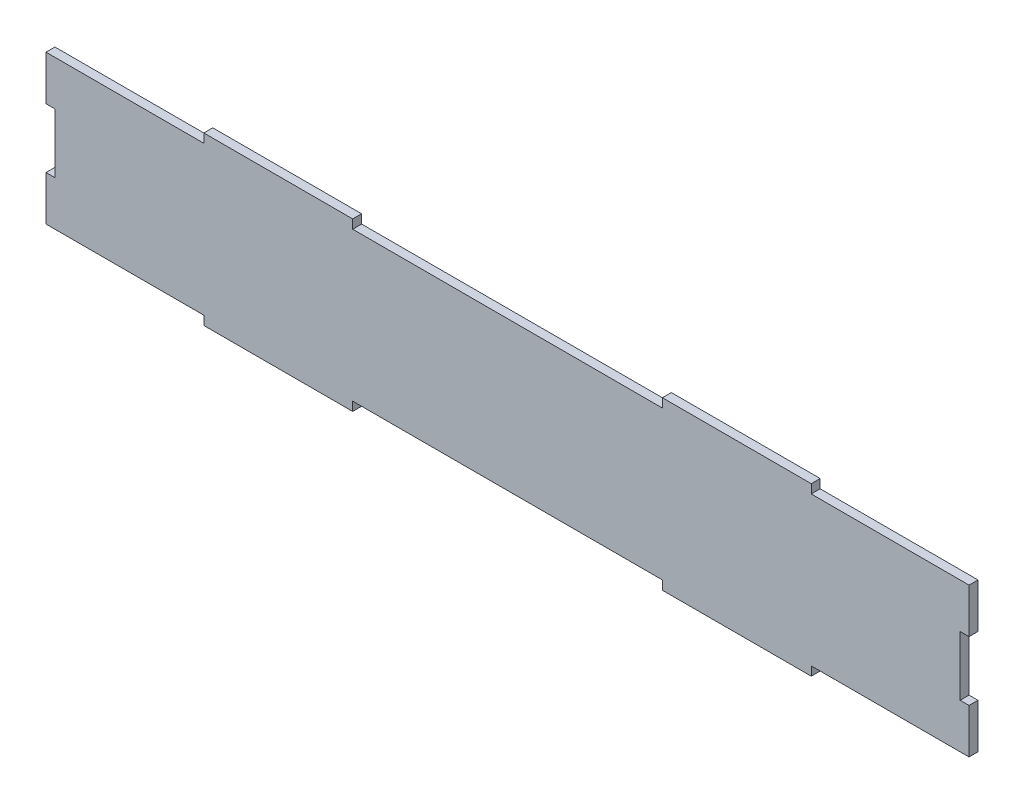
ISO-10303-21;
HEADER;
FILE_DESCRIPTION(('STEP AP214'),'2;1');
FILE_NAME('part.step','',(''),(''),'','','');
FILE_SCHEMA(('AUTOMOTIVE_DESIGN { 1 0 10303 214 1 1 1 1 }'));
ENDSEC;
DATA;
#1=APPLICATION_CONTEXT('core data for automotive mechanical design processes');
#2=APPLICATION_PROTOCOL_DEFINITION('international standard','automotive_design',2000,#1);
#3=PRODUCT_CONTEXT('',#1,'mechanical');
#4=PRODUCT('Part','Part','',(#3));
#5=PRODUCT_RELATED_PRODUCT_CATEGORY('part','',(#4));
#6=PRODUCT_DEFINITION_FORMATION('','',#4);
#7=PRODUCT_DEFINITION_CONTEXT('part definition',#1,'design');
#8=PRODUCT_DEFINITION('design','',#6,#7);
#9=PRODUCT_DEFINITION_SHAPE('','',#8);
#10=(LENGTH_UNIT() NAMED_UNIT(*) SI_UNIT(.MILLI.,.METRE.));
#11=(NAMED_UNIT(*) PLANE_ANGLE_UNIT() SI_UNIT($,.RADIAN.));
#12=(NAMED_UNIT(*) SI_UNIT($,.STERADIAN.) SOLID_ANGLE_UNIT());
#13=UNCERTAINTY_MEASURE_WITH_UNIT(LENGTH_MEASURE(1.E-05),#10,'distance_accuracy_value','');
#14=(GEOMETRIC_REPRESENTATION_CONTEXT(3) GLOBAL_UNCERTAINTY_ASSIGNED_CONTEXT((#13)) GLOBAL_UNIT_ASSIGNED_CONTEXT((#10,
#11,#12)) REPRESENTATION_CONTEXT('',''));
#15=CARTESIAN_POINT('',(0.,0.,0.));
#16=DIRECTION('',(0.,0.,1.));
#17=DIRECTION('',(1.,0.,0.));
#18=AXIS2_PLACEMENT_3D('',#15,#16,#17);
#19=CARTESIAN_POINT('',(155.,-25.,3.));
#20=DIRECTION('',(0.,1.,0.));
#21=DIRECTION('',(0.,0.,1.));
#22=AXIS2_PLACEMENT_3D('',#19,#20,#21);
#23=PLANE('',#22);
#24=DIRECTION('',(1.,0.,0.));
#25=VECTOR('',#24,1.);
#26=CARTESIAN_POINT('',(155.,-25.,0.));
#27=LINE('',#26,#25);
#28=CARTESIAN_POINT('',(102.,-25.,0.));
#29=VERTEX_POINT('',#28);
#30=CARTESIAN_POINT('',(155.,-25.,0.));
#31=VERTEX_POINT('',#30);
#32=EDGE_CURVE('E145',#29,#31,#27,.T.);
#33=ORIENTED_EDGE('',*,*,#32,.T.);
#34=DIRECTION('',(0.,0.,-1.));
#35=VECTOR('',#34,1.);
#36=CARTESIAN_POINT('',(155.,-25.,3.));
#37=LINE('',#36,#35);
#38=CARTESIAN_POINT('',(155.,-25.,3.));
#39=VERTEX_POINT('',#38);
#40=EDGE_CURVE('E11',#39,#31,#37,.T.);
#41=ORIENTED_EDGE('',*,*,#40,.F.);
#42=DIRECTION('',(1.,0.,0.));
#43=VECTOR('',#42,1.);
#44=CARTESIAN_POINT('',(102.,-25.,3.));
#45=LINE('',#44,#43);
#46=CARTESIAN_POINT('',(102.,-25.,3.));
#47=VERTEX_POINT('',#46);
#48=EDGE_CURVE('E151',#47,#39,#45,.T.);
#49=ORIENTED_EDGE('',*,*,#48,.F.);
#50=DIRECTION('',(0.,0.,-1.));
#51=VECTOR('',#50,1.);
#52=CARTESIAN_POINT('',(102.,-25.,3.));
#53=LINE('',#52,#51);
#54=EDGE_CURVE('E245',#47,#29,#53,.T.);
#55=ORIENTED_EDGE('',*,*,#54,.T.);
#56=EDGE_LOOP('',(#33,#41,#49,#55));
#57=FACE_BOUND('',#56,.T.);
#58=ADVANCED_FACE('F33',(#57),#23,.F.);
#59=CARTESIAN_POINT('',(155.,-10.,3.));
#60=DIRECTION('',(-1.,0.,0.));
#61=DIRECTION('',(0.,0.,1.));
#62=AXIS2_PLACEMENT_3D('',#59,#60,#61);
#63=PLANE('',#62);
#64=DIRECTION('',(0.,1.,0.));
#65=VECTOR('',#64,1.);
#66=CARTESIAN_POINT('',(155.,-10.,0.));
#67=LINE('',#66,#65);
#68=CARTESIAN_POINT('',(155.,-10.,0.));
#69=VERTEX_POINT('',#68);
#70=EDGE_CURVE('E250',#31,#69,#67,.T.);
#71=ORIENTED_EDGE('',*,*,#70,.T.);
#72=DIRECTION('',(0.,0.,-1.));
#73=VECTOR('',#72,1.);
#74=CARTESIAN_POINT('',(155.,-10.,3.));
#75=LINE('',#74,#73);
#76=CARTESIAN_POINT('',(155.,-10.,3.));
#77=VERTEX_POINT('',#76);
#78=EDGE_CURVE('E41',#77,#69,#75,.T.);
#79=ORIENTED_EDGE('',*,*,#78,.F.);
#80=DIRECTION('',(0.,1.,0.));
#81=VECTOR('',#80,1.);
#82=CARTESIAN_POINT('',(155.,-10.,3.));
#83=LINE('',#82,#81);
#84=EDGE_CURVE('E453',#39,#77,#83,.T.);
#85=ORIENTED_EDGE('',*,*,#84,.F.);
#86=ORIENTED_EDGE('',*,*,#40,.T.);
#87=EDGE_LOOP('',(#71,#79,#85,#86));
#88=FACE_BOUND('',#87,.T.);
#89=ADVANCED_FACE('F456',(#88),#63,.F.);
#90=CARTESIAN_POINT('',(152.,-9.99999999999999,3.));
#91=DIRECTION('',(0.,-1.,0.));
#92=DIRECTION('',(1.,0.,0.));
#93=AXIS2_PLACEMENT_3D('',#90,#91,#92);
#94=PLANE('',#93);
#95=DIRECTION('',(-1.,0.,0.));
#96=VECTOR('',#95,1.);
#97=CARTESIAN_POINT('',(152.,-9.99999999999999,0.));
#98=LINE('',#97,#96);
#99=CARTESIAN_POINT('',(152.,-9.99999999999999,0.));
#100=VERTEX_POINT('',#99);
#101=EDGE_CURVE('E252',#69,#100,#98,.T.);
#102=ORIENTED_EDGE('',*,*,#101,.T.);
#103=DIRECTION('',(0.,0.,-1.));
#104=VECTOR('',#103,1.);
#105=CARTESIAN_POINT('',(152.,-9.99999999999999,3.));
#106=LINE('',#105,#104);
#107=CARTESIAN_POINT('',(152.,-9.99999999999999,3.));
#108=VERTEX_POINT('',#107);
#109=EDGE_CURVE('E372',#108,#100,#106,.T.);
#110=ORIENTED_EDGE('',*,*,#109,.F.);
#111=DIRECTION('',(-1.,0.,0.));
#112=VECTOR('',#111,1.);
#113=CARTESIAN_POINT('',(152.,-9.99999999999999,3.));
#114=LINE('',#113,#112);
#115=EDGE_CURVE('E381',#77,#108,#114,.T.);
#116=ORIENTED_EDGE('',*,*,#115,.F.);
#117=ORIENTED_EDGE('',*,*,#78,.T.);
#118=EDGE_LOOP('',(#102,#110,#116,#117));
#119=FACE_BOUND('',#118,.T.);
#120=ADVANCED_FACE('F379',(#119),#94,.F.);
#121=CARTESIAN_POINT('',(152.,10.,3.));
#122=DIRECTION('',(-1.,0.,0.));
#123=DIRECTION('',(0.,0.,1.));
#124=AXIS2_PLACEMENT_3D('',#121,#122,#123);
#125=PLANE('',#124);
#126=DIRECTION('',(0.,1.,0.));
#127=VECTOR('',#126,1.);
#128=CARTESIAN_POINT('',(152.,10.,0.));
#129=LINE('',#128,#127);
#130=CARTESIAN_POINT('',(152.,10.,0.));
#131=VERTEX_POINT('',#130);
#132=EDGE_CURVE('E254',#100,#131,#129,.T.);
#133=ORIENTED_EDGE('',*,*,#132,.T.);
#134=DIRECTION('',(0.,0.,-1.));
#135=VECTOR('',#134,1.);
#136=CARTESIAN_POINT('',(152.,10.,3.));
#137=LINE('',#136,#135);
#138=CARTESIAN_POINT('',(152.,10.,3.));
#139=VERTEX_POINT('',#138);
#140=EDGE_CURVE('E369',#139,#131,#137,.T.);
#141=ORIENTED_EDGE('',*,*,#140,.F.);
#142=DIRECTION('',(0.,1.,0.));
#143=VECTOR('',#142,1.);
#144=CARTESIAN_POINT('',(152.,10.,3.));
#145=LINE('',#144,#143);
#146=EDGE_CURVE('E399',#108,#139,#145,.T.);
#147=ORIENTED_EDGE('',*,*,#146,.F.);
#148=ORIENTED_EDGE('',*,*,#109,.T.);
#149=EDGE_LOOP('',(#133,#141,#147,#148));
#150=FACE_BOUND('',#149,.T.);
#151=ADVANCED_FACE('F390',(#150),#125,.F.);
#152=CARTESIAN_POINT('',(155.,10.,3.));
#153=DIRECTION('',(0.,1.,0.));
#154=DIRECTION('',(0.,0.,1.));
#155=AXIS2_PLACEMENT_3D('',#152,#153,#154);
#156=PLANE('',#155);
#157=DIRECTION('',(1.,0.,0.));
#158=VECTOR('',#157,1.);
#159=CARTESIAN_POINT('',(155.,10.,0.));
#160=LINE('',#159,#158);
#161=CARTESIAN_POINT('',(155.,10.,0.));
#162=VERTEX_POINT('',#161);
#163=EDGE_CURVE('E256',#131,#162,#160,.T.);
#164=ORIENTED_EDGE('',*,*,#163,.T.);
#165=DIRECTION('',(0.,0.,-1.));
#166=VECTOR('',#165,1.);
#167=CARTESIAN_POINT('',(155.,10.,3.));
#168=LINE('',#167,#166);
#169=CARTESIAN_POINT('',(155.,10.,3.));
#170=VERTEX_POINT('',#169);
#171=EDGE_CURVE('E366',#170,#162,#168,.T.);
#172=ORIENTED_EDGE('',*,*,#171,.F.);
#173=DIRECTION('',(1.,0.,0.));
#174=VECTOR('',#173,1.);
#175=CARTESIAN_POINT('',(155.,10.,3.));
#176=LINE('',#175,#174);
#177=EDGE_CURVE('E396',#139,#170,#176,.T.);
#178=ORIENTED_EDGE('',*,*,#177,.F.);
#179=ORIENTED_EDGE('',*,*,#140,.T.);
#180=EDGE_LOOP('',(#164,#172,#178,#179));
#181=FACE_BOUND('',#180,.T.);
#182=ADVANCED_FACE('F394',(#181),#156,.F.);
#183=CARTESIAN_POINT('',(155.,25.,3.));
#184=DIRECTION('',(-1.,0.,0.));
#185=DIRECTION('',(0.,0.,1.));
#186=AXIS2_PLACEMENT_3D('',#183,#184,#185);
#187=PLANE('',#186);
#188=DIRECTION('',(0.,1.,0.));
#189=VECTOR('',#188,1.);
#190=CARTESIAN_POINT('',(155.,25.,0.));
#191=LINE('',#190,#189);
#192=CARTESIAN_POINT('',(155.,25.,0.));
#193=VERTEX_POINT('',#192);
#194=EDGE_CURVE('E258',#162,#193,#191,.T.);
#195=ORIENTED_EDGE('',*,*,#194,.T.);
#196=DIRECTION('',(0.,0.,-1.));
#197=VECTOR('',#196,1.);
#198=CARTESIAN_POINT('',(155.,25.,3.));
#199=LINE('',#198,#197);
#200=CARTESIAN_POINT('',(155.,25.,3.));
#201=VERTEX_POINT('',#200);
#202=EDGE_CURVE('E363',#201,#193,#199,.T.);
#203=ORIENTED_EDGE('',*,*,#202,.F.);
#204=DIRECTION('',(0.,1.,0.));
#205=VECTOR('',#204,1.);
#206=CARTESIAN_POINT('',(155.,25.,3.));
#207=LINE('',#206,#205);
#208=EDGE_CURVE('E398',#170,#201,#207,.T.);
#209=ORIENTED_EDGE('',*,*,#208,.F.);
#210=ORIENTED_EDGE('',*,*,#171,.T.);
#211=EDGE_LOOP('',(#195,#203,#209,#210));
#212=FACE_BOUND('',#211,.T.);
#213=ADVANCED_FACE('F468',(#212),#187,.F.);
#214=CARTESIAN_POINT('',(102.,25.,3.));
#215=DIRECTION('',(0.,-1.,0.));
#216=DIRECTION('',(0.,0.,-1.));
#217=AXIS2_PLACEMENT_3D('',#214,#215,#216);
#218=PLANE('',#217);
#219=DIRECTION('',(-1.,0.,0.));
#220=VECTOR('',#219,1.);
#221=CARTESIAN_POINT('',(102.,25.,0.));
#222=LINE('',#221,#220);
#223=CARTESIAN_POINT('',(102.,25.,0.));
#224=VERTEX_POINT('',#223);
#225=EDGE_CURVE('E261',#193,#224,#222,.T.);
#226=ORIENTED_EDGE('',*,*,#225,.T.);
#227=DIRECTION('',(0.,0.,-1.));
#228=VECTOR('',#227,1.);
#229=CARTESIAN_POINT('',(102.,25.,3.));
#230=LINE('',#229,#228);
#231=CARTESIAN_POINT('',(102.,25.,3.));
#232=VERTEX_POINT('',#231);
#233=EDGE_CURVE('E360',#232,#224,#230,.T.);
#234=ORIENTED_EDGE('',*,*,#233,.F.);
#235=DIRECTION('',(-1.,0.,0.));
#236=VECTOR('',#235,1.);
#237=CARTESIAN_POINT('',(152.,25.,3.));
#238=LINE('',#237,#236);
#239=EDGE_CURVE('E401',#201,#232,#238,.T.);
#240=ORIENTED_EDGE('',*,*,#239,.F.);
#241=ORIENTED_EDGE('',*,*,#202,.T.);
#242=EDGE_LOOP('',(#226,#234,#240,#241));
#243=FACE_BOUND('',#242,.T.);
#244=ADVANCED_FACE('F471',(#243),#218,.F.);
#245=CARTESIAN_POINT('',(102.,28.,3.));
#246=DIRECTION('',(-1.,0.,0.));
#247=DIRECTION('',(0.,0.,1.));
#248=AXIS2_PLACEMENT_3D('',#245,#246,#247);
#249=PLANE('',#248);
#250=DIRECTION('',(0.,1.,0.));
#251=VECTOR('',#250,1.);
#252=CARTESIAN_POINT('',(102.,28.,0.));
#253=LINE('',#252,#251);
#254=CARTESIAN_POINT('',(102.,28.,0.));
#255=VERTEX_POINT('',#254);
#256=EDGE_CURVE('E263',#224,#255,#253,.T.);
#257=ORIENTED_EDGE('',*,*,#256,.T.);
#258=DIRECTION('',(0.,0.,-1.));
#259=VECTOR('',#258,1.);
#260=CARTESIAN_POINT('',(102.,28.,3.));
#261=LINE('',#260,#259);
#262=CARTESIAN_POINT('',(102.,28.,3.));
#263=VERTEX_POINT('',#262);
#264=EDGE_CURVE('E357',#263,#255,#261,.T.);
#265=ORIENTED_EDGE('',*,*,#264,.F.);
#266=DIRECTION('',(0.,1.,0.));
#267=VECTOR('',#266,1.);
#268=CARTESIAN_POINT('',(102.,28.,3.));
#269=LINE('',#268,#267);
#270=EDGE_CURVE('E407',#232,#263,#269,.T.);
#271=ORIENTED_EDGE('',*,*,#270,.F.);
#272=ORIENTED_EDGE('',*,*,#233,.T.);
#273=EDGE_LOOP('',(#257,#265,#271,#272));
#274=FACE_BOUND('',#273,.T.);
#275=ADVANCED_FACE('F475',(#274),#249,.F.);
#276=CARTESIAN_POINT('',(52.,28.,3.));
#277=DIRECTION('',(0.,-1.,0.));
#278=DIRECTION('',(0.,0.,-1.));
#279=AXIS2_PLACEMENT_3D('',#276,#277,#278);
#280=PLANE('',#279);
#281=DIRECTION('',(-1.,0.,0.));
#282=VECTOR('',#281,1.);
#283=CARTESIAN_POINT('',(52.,28.,0.));
#284=LINE('',#283,#282);
#285=CARTESIAN_POINT('',(52.,28.,0.));
#286=VERTEX_POINT('',#285);
#287=EDGE_CURVE('E265',#255,#286,#284,.T.);
#288=ORIENTED_EDGE('',*,*,#287,.T.);
#289=DIRECTION('',(0.,0.,-1.));
#290=VECTOR('',#289,1.);
#291=CARTESIAN_POINT('',(52.,28.,3.));
#292=LINE('',#291,#290);
#293=CARTESIAN_POINT('',(52.,28.,3.));
#294=VERTEX_POINT('',#293);
#295=EDGE_CURVE('E354',#294,#286,#292,.T.);
#296=ORIENTED_EDGE('',*,*,#295,.F.);
#297=DIRECTION('',(-1.,0.,0.));
#298=VECTOR('',#297,1.);
#299=CARTESIAN_POINT('',(52.,28.,3.));
#300=LINE('',#299,#298);
#301=EDGE_CURVE('E409',#263,#294,#300,.T.);
#302=ORIENTED_EDGE('',*,*,#301,.F.);
#303=ORIENTED_EDGE('',*,*,#264,.T.);
#304=EDGE_LOOP('',(#288,#296,#302,#303));
#305=FACE_BOUND('',#304,.T.);
#306=ADVANCED_FACE('F479',(#305),#280,.F.);
#307=CARTESIAN_POINT('',(52.,25.,3.));
#308=DIRECTION('',(1.,0.,0.));
#309=DIRECTION('',(0.,0.,-1.));
#310=AXIS2_PLACEMENT_3D('',#307,#308,#309);
#311=PLANE('',#310);
#312=DIRECTION('',(0.,-1.,0.));
#313=VECTOR('',#312,1.);
#314=CARTESIAN_POINT('',(52.,25.,0.));
#315=LINE('',#314,#313);
#316=CARTESIAN_POINT('',(52.,25.,0.));
#317=VERTEX_POINT('',#316);
#318=EDGE_CURVE('E267',#286,#317,#315,.T.);
#319=ORIENTED_EDGE('',*,*,#318,.T.);
#320=DIRECTION('',(0.,0.,-1.));
#321=VECTOR('',#320,1.);
#322=CARTESIAN_POINT('',(52.,25.,3.));
#323=LINE('',#322,#321);
#324=CARTESIAN_POINT('',(52.,25.,3.));
#325=VERTEX_POINT('',#324);
#326=EDGE_CURVE('E351',#325,#317,#323,.T.);
#327=ORIENTED_EDGE('',*,*,#326,.F.);
#328=DIRECTION('',(0.,-1.,0.));
#329=VECTOR('',#328,1.);
#330=CARTESIAN_POINT('',(52.,25.,3.));
#331=LINE('',#330,#329);
#332=EDGE_CURVE('E411',#294,#325,#331,.T.);
#333=ORIENTED_EDGE('',*,*,#332,.F.);
#334=ORIENTED_EDGE('',*,*,#295,.T.);
#335=EDGE_LOOP('',(#319,#327,#333,#334));
#336=FACE_BOUND('',#335,.T.);
#337=ADVANCED_FACE('F483',(#336),#311,.F.);
#338=CARTESIAN_POINT('',(-51.9999999999999,25.,3.));
#339=DIRECTION('',(0.,-1.,0.));
#340=DIRECTION('',(0.,0.,-1.));
#341=AXIS2_PLACEMENT_3D('',#338,#339,#340);
#342=PLANE('',#341);
#343=DIRECTION('',(-1.,0.,0.));
#344=VECTOR('',#343,1.);
#345=CARTESIAN_POINT('',(-51.9999999999999,25.,0.));
#346=LINE('',#345,#344);
#347=CARTESIAN_POINT('',(-51.9999999999999,25.,0.));
#348=VERTEX_POINT('',#347);
#349=EDGE_CURVE('E269',#317,#348,#346,.T.);
#350=ORIENTED_EDGE('',*,*,#349,.T.);
#351=DIRECTION('',(0.,0.,-1.));
#352=VECTOR('',#351,1.);
#353=CARTESIAN_POINT('',(-51.9999999999999,25.,3.));
#354=LINE('',#353,#352);
#355=CARTESIAN_POINT('',(-51.9999999999999,25.,3.));
#356=VERTEX_POINT('',#355);
#357=EDGE_CURVE('E348',#356,#348,#354,.T.);
#358=ORIENTED_EDGE('',*,*,#357,.F.);
#359=DIRECTION('',(-1.,0.,0.));
#360=VECTOR('',#359,1.);
#361=CARTESIAN_POINT('',(-51.9999999999999,25.,3.));
#362=LINE('',#361,#360);
#363=EDGE_CURVE('E413',#325,#356,#362,.T.);
#364=ORIENTED_EDGE('',*,*,#363,.F.);
#365=ORIENTED_EDGE('',*,*,#326,.T.);
#366=EDGE_LOOP('',(#350,#358,#364,#365));
#367=FACE_BOUND('',#366,.T.);
#368=ADVANCED_FACE('F487',(#367),#342,.F.);
#369=CARTESIAN_POINT('',(-51.9999999999999,28.,3.));
#370=DIRECTION('',(-1.,0.,0.));
#371=DIRECTION('',(0.,0.,1.));
#372=AXIS2_PLACEMENT_3D('',#369,#370,#371);
#373=PLANE('',#372);
#374=DIRECTION('',(0.,1.,0.));
#375=VECTOR('',#374,1.);
#376=CARTESIAN_POINT('',(-51.9999999999999,28.,0.));
#377=LINE('',#376,#375);
#378=CARTESIAN_POINT('',(-51.9999999999999,28.,0.));
#379=VERTEX_POINT('',#378);
#380=EDGE_CURVE('E271',#348,#379,#377,.T.);
#381=ORIENTED_EDGE('',*,*,#380,.T.);
#382=DIRECTION('',(0.,0.,-1.));
#383=VECTOR('',#382,1.);
#384=CARTESIAN_POINT('',(-51.9999999999999,28.,3.));
#385=LINE('',#384,#383);
#386=CARTESIAN_POINT('',(-51.9999999999999,28.,3.));
#387=VERTEX_POINT('',#386);
#388=EDGE_CURVE('E345',#387,#379,#385,.T.);
#389=ORIENTED_EDGE('',*,*,#388,.F.);
#390=DIRECTION('',(0.,1.,0.));
#391=VECTOR('',#390,1.);
#392=CARTESIAN_POINT('',(-51.9999999999999,28.,3.));
#393=LINE('',#392,#391);
#394=EDGE_CURVE('E415',#356,#387,#393,.T.);
#395=ORIENTED_EDGE('',*,*,#394,.F.);
#396=ORIENTED_EDGE('',*,*,#357,.T.);
#397=EDGE_LOOP('',(#381,#389,#395,#396));
#398=FACE_BOUND('',#397,.T.);
#399=ADVANCED_FACE('F491',(#398),#373,.F.);
#400=CARTESIAN_POINT('',(-102.,28.,3.));
#401=DIRECTION('',(0.,-1.,0.));
#402=DIRECTION('',(0.,0.,-1.));
#403=AXIS2_PLACEMENT_3D('',#400,#401,#402);
#404=PLANE('',#403);
#405=DIRECTION('',(-1.,0.,0.));
#406=VECTOR('',#405,1.);
#407=CARTESIAN_POINT('',(-102.,28.,0.));
#408=LINE('',#407,#406);
#409=CARTESIAN_POINT('',(-102.,28.,0.));
#410=VERTEX_POINT('',#409);
#411=EDGE_CURVE('E273',#379,#410,#408,.T.);
#412=ORIENTED_EDGE('',*,*,#411,.T.);
#413=DIRECTION('',(0.,0.,-1.));
#414=VECTOR('',#413,1.);
#415=CARTESIAN_POINT('',(-102.,28.,3.));
#416=LINE('',#415,#414);
#417=CARTESIAN_POINT('',(-102.,28.,3.));
#418=VERTEX_POINT('',#417);
#419=EDGE_CURVE('E342',#418,#410,#416,.T.);
#420=ORIENTED_EDGE('',*,*,#419,.F.);
#421=DIRECTION('',(-1.,0.,0.));
#422=VECTOR('',#421,1.);
#423=CARTESIAN_POINT('',(-102.,28.,3.));
#424=LINE('',#423,#422);
#425=EDGE_CURVE('E417',#387,#418,#424,.T.);
#426=ORIENTED_EDGE('',*,*,#425,.F.);
#427=ORIENTED_EDGE('',*,*,#388,.T.);
#428=EDGE_LOOP('',(#412,#420,#426,#427));
#429=FACE_BOUND('',#428,.T.);
#430=ADVANCED_FACE('F495',(#429),#404,.F.);
#431=CARTESIAN_POINT('',(-102.,25.,3.));
#432=DIRECTION('',(1.,0.,0.));
#433=DIRECTION('',(0.,0.,-1.));
#434=AXIS2_PLACEMENT_3D('',#431,#432,#433);
#435=PLANE('',#434);
#436=DIRECTION('',(0.,-1.,0.));
#437=VECTOR('',#436,1.);
#438=CARTESIAN_POINT('',(-102.,25.,0.));
#439=LINE('',#438,#437);
#440=CARTESIAN_POINT('',(-102.,25.,0.));
#441=VERTEX_POINT('',#440);
#442=EDGE_CURVE('E275',#410,#441,#439,.T.);
#443=ORIENTED_EDGE('',*,*,#442,.T.);
#444=DIRECTION('',(0.,0.,-1.));
#445=VECTOR('',#444,1.);
#446=CARTESIAN_POINT('',(-102.,25.,3.));
#447=LINE('',#446,#445);
#448=CARTESIAN_POINT('',(-102.,25.,3.));
#449=VERTEX_POINT('',#448);
#450=EDGE_CURVE('E339',#449,#441,#447,.T.);
#451=ORIENTED_EDGE('',*,*,#450,.F.);
#452=DIRECTION('',(0.,-1.,0.));
#453=VECTOR('',#452,1.);
#454=CARTESIAN_POINT('',(-102.,25.,3.));
#455=LINE('',#454,#453);
#456=EDGE_CURVE('E419',#418,#449,#455,.T.);
#457=ORIENTED_EDGE('',*,*,#456,.F.);
#458=ORIENTED_EDGE('',*,*,#419,.T.);
#459=EDGE_LOOP('',(#443,#451,#457,#458));
#460=FACE_BOUND('',#459,.T.);
#461=ADVANCED_FACE('F499',(#460),#435,.F.);
#462=CARTESIAN_POINT('',(-152.,25.,3.));
#463=DIRECTION('',(0.,-1.,0.));
#464=DIRECTION('',(0.,0.,-1.));
#465=AXIS2_PLACEMENT_3D('',#462,#463,#464);
#466=PLANE('',#465);
#467=DIRECTION('',(-1.,0.,0.));
#468=VECTOR('',#467,1.);
#469=CARTESIAN_POINT('',(-152.,25.,0.));
#470=LINE('',#469,#468);
#471=CARTESIAN_POINT('',(-155.,25.,0.));
#472=VERTEX_POINT('',#471);
#473=EDGE_CURVE('E278',#441,#472,#470,.T.);
#474=ORIENTED_EDGE('',*,*,#473,.T.);
#475=DIRECTION('',(0.,0.,-1.));
#476=VECTOR('',#475,1.);
#477=CARTESIAN_POINT('',(-155.,25.,3.));
#478=LINE('',#477,#476);
#479=CARTESIAN_POINT('',(-155.,25.,3.));
#480=VERTEX_POINT('',#479);
#481=EDGE_CURVE('E336',#480,#472,#478,.T.);
#482=ORIENTED_EDGE('',*,*,#481,.F.);
#483=DIRECTION('',(-1.,0.,0.));
#484=VECTOR('',#483,1.);
#485=CARTESIAN_POINT('',(-152.,25.,3.));
#486=LINE('',#485,#484);
#487=EDGE_CURVE('E421',#449,#480,#486,.T.);
#488=ORIENTED_EDGE('',*,*,#487,.F.);
#489=ORIENTED_EDGE('',*,*,#450,.T.);
#490=EDGE_LOOP('',(#474,#482,#488,#489));
#491=FACE_BOUND('',#490,.T.);
#492=ADVANCED_FACE('F503',(#491),#466,.F.);
#493=CARTESIAN_POINT('',(-155.,25.,3.));
#494=DIRECTION('',(1.,0.,0.));
#495=DIRECTION('',(0.,0.,-1.));
#496=AXIS2_PLACEMENT_3D('',#493,#494,#495);
#497=PLANE('',#496);
#498=DIRECTION('',(0.,-1.,0.));
#499=VECTOR('',#498,1.);
#500=CARTESIAN_POINT('',(-155.,25.,0.));
#501=LINE('',#500,#499);
#502=CARTESIAN_POINT('',(-155.,10.,0.));
#503=VERTEX_POINT('',#502);
#504=EDGE_CURVE('E280',#472,#503,#501,.T.);
#505=ORIENTED_EDGE('',*,*,#504,.T.);
#506=DIRECTION('',(0.,0.,-1.));
#507=VECTOR('',#506,1.);
#508=CARTESIAN_POINT('',(-155.,10.,3.));
#509=LINE('',#508,#507);
#510=CARTESIAN_POINT('',(-155.,10.,3.));
#511=VERTEX_POINT('',#510);
#512=EDGE_CURVE('E333',#511,#503,#509,.T.);
#513=ORIENTED_EDGE('',*,*,#512,.F.);
#514=DIRECTION('',(0.,-1.,0.));
#515=VECTOR('',#514,1.);
#516=CARTESIAN_POINT('',(-155.,25.,3.));
#517=LINE('',#516,#515);
#518=EDGE_CURVE('E423',#480,#511,#517,.T.);
#519=ORIENTED_EDGE('',*,*,#518,.F.);
#520=ORIENTED_EDGE('',*,*,#481,.T.);
#521=EDGE_LOOP('',(#505,#513,#519,#520));
#522=FACE_BOUND('',#521,.T.);
#523=ADVANCED_FACE('F507',(#522),#497,.F.);
#524=CARTESIAN_POINT('',(-155.,10.,3.));
#525=DIRECTION('',(0.,1.,0.));
#526=DIRECTION('',(0.,0.,1.));
#527=AXIS2_PLACEMENT_3D('',#524,#525,#526);
#528=PLANE('',#527);
#529=DIRECTION('',(1.,0.,0.));
#530=VECTOR('',#529,1.);
#531=CARTESIAN_POINT('',(-155.,10.,0.));
#532=LINE('',#531,#530);
#533=CARTESIAN_POINT('',(-152.,10.,0.));
#534=VERTEX_POINT('',#533);
#535=EDGE_CURVE('E282',#503,#534,#532,.T.);
#536=ORIENTED_EDGE('',*,*,#535,.T.);
#537=DIRECTION('',(0.,0.,-1.));
#538=VECTOR('',#537,1.);
#539=CARTESIAN_POINT('',(-152.,10.,3.));
#540=LINE('',#539,#538);
#541=CARTESIAN_POINT('',(-152.,10.,3.));
#542=VERTEX_POINT('',#541);
#543=EDGE_CURVE('E330',#542,#534,#540,.T.);
#544=ORIENTED_EDGE('',*,*,#543,.F.);
#545=DIRECTION('',(1.,0.,0.));
#546=VECTOR('',#545,1.);
#547=CARTESIAN_POINT('',(-155.,10.,3.));
#548=LINE('',#547,#546);
#549=EDGE_CURVE('E425',#511,#542,#548,.T.);
#550=ORIENTED_EDGE('',*,*,#549,.F.);
#551=ORIENTED_EDGE('',*,*,#512,.T.);
#552=EDGE_LOOP('',(#536,#544,#550,#551));
#553=FACE_BOUND('',#552,.T.);
#554=ADVANCED_FACE('F511',(#553),#528,.F.);
#555=CARTESIAN_POINT('',(-152.,10.,3.));
#556=DIRECTION('',(1.,0.,0.));
#557=DIRECTION('',(0.,0.,-1.));
#558=AXIS2_PLACEMENT_3D('',#555,#556,#557);
#559=PLANE('',#558);
#560=DIRECTION('',(0.,-1.,0.));
#561=VECTOR('',#560,1.);
#562=CARTESIAN_POINT('',(-152.,10.,0.));
#563=LINE('',#562,#561);
#564=CARTESIAN_POINT('',(-152.,-9.99999999999999,0.));
#565=VERTEX_POINT('',#564);
#566=EDGE_CURVE('E284',#534,#565,#563,.T.);
#567=ORIENTED_EDGE('',*,*,#566,.T.);
#568=DIRECTION('',(0.,0.,-1.));
#569=VECTOR('',#568,1.);
#570=CARTESIAN_POINT('',(-152.,-9.99999999999999,3.));
#571=LINE('',#570,#569);
#572=CARTESIAN_POINT('',(-152.,-9.99999999999999,3.));
#573=VERTEX_POINT('',#572);
#574=EDGE_CURVE('E327',#573,#565,#571,.T.);
#575=ORIENTED_EDGE('',*,*,#574,.F.);
#576=DIRECTION('',(0.,-1.,0.));
#577=VECTOR('',#576,1.);
#578=CARTESIAN_POINT('',(-152.,10.,3.));
#579=LINE('',#578,#577);
#580=EDGE_CURVE('E427',#542,#573,#579,.T.);
#581=ORIENTED_EDGE('',*,*,#580,.F.);
#582=ORIENTED_EDGE('',*,*,#543,.T.);
#583=EDGE_LOOP('',(#567,#575,#581,#582));
#584=FACE_BOUND('',#583,.T.);
#585=ADVANCED_FACE('F515',(#584),#559,.F.);
#586=CARTESIAN_POINT('',(-152.,-9.99999999999999,3.));
#587=DIRECTION('',(0.,-1.,0.));
#588=DIRECTION('',(1.,0.,0.));
#589=AXIS2_PLACEMENT_3D('',#586,#587,#588);
#590=PLANE('',#589);
#591=DIRECTION('',(-1.,0.,0.));
#592=VECTOR('',#591,1.);
#593=CARTESIAN_POINT('',(-152.,-9.99999999999999,0.));
#594=LINE('',#593,#592);
#595=CARTESIAN_POINT('',(-155.,-10.,0.));
#596=VERTEX_POINT('',#595);
#597=EDGE_CURVE('E286',#565,#596,#594,.T.);
#598=ORIENTED_EDGE('',*,*,#597,.T.);
#599=DIRECTION('',(0.,0.,-1.));
#600=VECTOR('',#599,1.);
#601=CARTESIAN_POINT('',(-155.,-10.,3.));
#602=LINE('',#601,#600);
#603=CARTESIAN_POINT('',(-155.,-10.,3.));
#604=VERTEX_POINT('',#603);
#605=EDGE_CURVE('E324',#604,#596,#602,.T.);
#606=ORIENTED_EDGE('',*,*,#605,.F.);
#607=DIRECTION('',(-1.,0.,0.));
#608=VECTOR('',#607,1.);
#609=CARTESIAN_POINT('',(-152.,-9.99999999999999,3.));
#610=LINE('',#609,#608);
#611=EDGE_CURVE('E429',#573,#604,#610,.T.);
#612=ORIENTED_EDGE('',*,*,#611,.F.);
#613=ORIENTED_EDGE('',*,*,#574,.T.);
#614=EDGE_LOOP('',(#598,#606,#612,#613));
#615=FACE_BOUND('',#614,.T.);
#616=ADVANCED_FACE('F519',(#615),#590,.F.);
#617=CARTESIAN_POINT('',(-155.,-10.,3.));
#618=DIRECTION('',(1.,0.,0.));
#619=DIRECTION('',(0.,0.,-1.));
#620=AXIS2_PLACEMENT_3D('',#617,#618,#619);
#621=PLANE('',#620);
#622=DIRECTION('',(0.,-1.,0.));
#623=VECTOR('',#622,1.);
#624=CARTESIAN_POINT('',(-155.,-10.,0.));
#625=LINE('',#624,#623);
#626=CARTESIAN_POINT('',(-155.,-25.,0.));
#627=VERTEX_POINT('',#626);
#628=EDGE_CURVE('E288',#596,#627,#625,.T.);
#629=ORIENTED_EDGE('',*,*,#628,.T.);
#630=DIRECTION('',(0.,0.,-1.));
#631=VECTOR('',#630,1.);
#632=CARTESIAN_POINT('',(-155.,-25.,3.));
#633=LINE('',#632,#631);
#634=CARTESIAN_POINT('',(-155.,-25.,3.));
#635=VERTEX_POINT('',#634);
#636=EDGE_CURVE('E321',#635,#627,#633,.T.);
#637=ORIENTED_EDGE('',*,*,#636,.F.);
#638=DIRECTION('',(0.,-1.,0.));
#639=VECTOR('',#638,1.);
#640=CARTESIAN_POINT('',(-155.,-10.,3.));
#641=LINE('',#640,#639);
#642=EDGE_CURVE('E431',#604,#635,#641,.T.);
#643=ORIENTED_EDGE('',*,*,#642,.F.);
#644=ORIENTED_EDGE('',*,*,#605,.T.);
#645=EDGE_LOOP('',(#629,#637,#643,#644));
#646=FACE_BOUND('',#645,.T.);
#647=ADVANCED_FACE('F523',(#646),#621,.F.);
#648=CARTESIAN_POINT('',(-152.,-25.,3.));
#649=DIRECTION('',(0.,1.,0.));
#650=DIRECTION('',(0.,0.,1.));
#651=AXIS2_PLACEMENT_3D('',#648,#649,#650);
#652=PLANE('',#651);
#653=DIRECTION('',(1.,0.,0.));
#654=VECTOR('',#653,1.);
#655=CARTESIAN_POINT('',(-152.,-25.,0.));
#656=LINE('',#655,#654);
#657=CARTESIAN_POINT('',(-102.,-25.,0.));
#658=VERTEX_POINT('',#657);
#659=EDGE_CURVE('E291',#627,#658,#656,.T.);
#660=ORIENTED_EDGE('',*,*,#659,.T.);
#661=DIRECTION('',(0.,0.,-1.));
#662=VECTOR('',#661,1.);
#663=CARTESIAN_POINT('',(-102.,-25.,3.));
#664=LINE('',#663,#662);
#665=CARTESIAN_POINT('',(-102.,-25.,3.));
#666=VERTEX_POINT('',#665);
#667=EDGE_CURVE('E318',#666,#658,#664,.T.);
#668=ORIENTED_EDGE('',*,*,#667,.F.);
#669=DIRECTION('',(1.,0.,0.));
#670=VECTOR('',#669,1.);
#671=CARTESIAN_POINT('',(-155.,-25.,3.));
#672=LINE('',#671,#670);
#673=EDGE_CURVE('E433',#635,#666,#672,.T.);
#674=ORIENTED_EDGE('',*,*,#673,.F.);
#675=ORIENTED_EDGE('',*,*,#636,.T.);
#676=EDGE_LOOP('',(#660,#668,#674,#675));
#677=FACE_BOUND('',#676,.T.);
#678=ADVANCED_FACE('F527',(#677),#652,.F.);
#679=CARTESIAN_POINT('',(-102.,-25.,3.));
#680=DIRECTION('',(1.,0.,0.));
#681=DIRECTION('',(0.,1.,0.));
#682=AXIS2_PLACEMENT_3D('',#679,#680,#681);
#683=PLANE('',#682);
#684=DIRECTION('',(0.,-1.,0.));
#685=VECTOR('',#684,1.);
#686=CARTESIAN_POINT('',(-102.,-25.,0.));
#687=LINE('',#686,#685);
#688=CARTESIAN_POINT('',(-102.,-28.,0.));
#689=VERTEX_POINT('',#688);
#690=EDGE_CURVE('E293',#658,#689,#687,.T.);
#691=ORIENTED_EDGE('',*,*,#690,.T.);
#692=DIRECTION('',(0.,0.,-1.));
#693=VECTOR('',#692,1.);
#694=CARTESIAN_POINT('',(-102.,-28.,3.));
#695=LINE('',#694,#693);
#696=CARTESIAN_POINT('',(-102.,-28.,3.));
#697=VERTEX_POINT('',#696);
#698=EDGE_CURVE('E315',#697,#689,#695,.T.);
#699=ORIENTED_EDGE('',*,*,#698,.F.);
#700=DIRECTION('',(0.,-1.,0.));
#701=VECTOR('',#700,1.);
#702=CARTESIAN_POINT('',(-102.,-25.,3.));
#703=LINE('',#702,#701);
#704=EDGE_CURVE('E435',#666,#697,#703,.T.);
#705=ORIENTED_EDGE('',*,*,#704,.F.);
#706=ORIENTED_EDGE('',*,*,#667,.T.);
#707=EDGE_LOOP('',(#691,#699,#705,#706));
#708=FACE_BOUND('',#707,.T.);
#709=ADVANCED_FACE('F531',(#708),#683,.F.);
#710=CARTESIAN_POINT('',(-102.,-28.,3.));
#711=DIRECTION('',(0.,1.,0.));
#712=DIRECTION('',(0.,0.,1.));
#713=AXIS2_PLACEMENT_3D('',#710,#711,#712);
#714=PLANE('',#713);
#715=DIRECTION('',(1.,0.,0.));
#716=VECTOR('',#715,1.);
#717=CARTESIAN_POINT('',(-102.,-28.,0.));
#718=LINE('',#717,#716);
#719=CARTESIAN_POINT('',(-51.9999999999999,-28.,0.));
#720=VERTEX_POINT('',#719);
#721=EDGE_CURVE('E295',#689,#720,#718,.T.);
#722=ORIENTED_EDGE('',*,*,#721,.T.);
#723=DIRECTION('',(0.,0.,-1.));
#724=VECTOR('',#723,1.);
#725=CARTESIAN_POINT('',(-51.9999999999999,-28.,3.));
#726=LINE('',#725,#724);
#727=CARTESIAN_POINT('',(-51.9999999999999,-28.,3.));
#728=VERTEX_POINT('',#727);
#729=EDGE_CURVE('E312',#728,#720,#726,.T.);
#730=ORIENTED_EDGE('',*,*,#729,.F.);
#731=DIRECTION('',(1.,0.,0.));
#732=VECTOR('',#731,1.);
#733=CARTESIAN_POINT('',(-102.,-28.,3.));
#734=LINE('',#733,#732);
#735=EDGE_CURVE('E437',#697,#728,#734,.T.);
#736=ORIENTED_EDGE('',*,*,#735,.F.);
#737=ORIENTED_EDGE('',*,*,#698,.T.);
#738=EDGE_LOOP('',(#722,#730,#736,#737));
#739=FACE_BOUND('',#738,.T.);
#740=ADVANCED_FACE('F535',(#739),#714,.F.);
#741=CARTESIAN_POINT('',(-51.9999999999999,-28.,3.));
#742=DIRECTION('',(-1.,0.,0.));
#743=DIRECTION('',(0.,0.,1.));
#744=AXIS2_PLACEMENT_3D('',#741,#742,#743);
#745=PLANE('',#744);
#746=DIRECTION('',(0.,1.,0.));
#747=VECTOR('',#746,1.);
#748=CARTESIAN_POINT('',(-51.9999999999999,-28.,0.));
#749=LINE('',#748,#747);
#750=CARTESIAN_POINT('',(-51.9999999999999,-25.,0.));
#751=VERTEX_POINT('',#750);
#752=EDGE_CURVE('E297',#720,#751,#749,.T.);
#753=ORIENTED_EDGE('',*,*,#752,.T.);
#754=DIRECTION('',(0.,0.,-1.));
#755=VECTOR('',#754,1.);
#756=CARTESIAN_POINT('',(-51.9999999999999,-25.,3.));
#757=LINE('',#756,#755);
#758=CARTESIAN_POINT('',(-51.9999999999999,-25.,3.));
#759=VERTEX_POINT('',#758);
#760=EDGE_CURVE('E309',#759,#751,#757,.T.);
#761=ORIENTED_EDGE('',*,*,#760,.F.);
#762=DIRECTION('',(0.,1.,0.));
#763=VECTOR('',#762,1.);
#764=CARTESIAN_POINT('',(-51.9999999999999,-28.,3.));
#765=LINE('',#764,#763);
#766=EDGE_CURVE('E439',#728,#759,#765,.T.);
#767=ORIENTED_EDGE('',*,*,#766,.F.);
#768=ORIENTED_EDGE('',*,*,#729,.T.);
#769=EDGE_LOOP('',(#753,#761,#767,#768));
#770=FACE_BOUND('',#769,.T.);
#771=ADVANCED_FACE('F445',(#770),#745,.F.);
#772=CARTESIAN_POINT('',(-51.9999999999999,-25.,3.));
#773=DIRECTION('',(0.,1.,0.));
#774=DIRECTION('',(-1.,0.,0.));
#775=AXIS2_PLACEMENT_3D('',#772,#773,#774);
#776=PLANE('',#775);
#777=DIRECTION('',(1.,0.,0.));
#778=VECTOR('',#777,1.);
#779=CARTESIAN_POINT('',(-51.9999999999999,-25.,0.));
#780=LINE('',#779,#778);
#781=CARTESIAN_POINT('',(52.,-25.,0.));
#782=VERTEX_POINT('',#781);
#783=EDGE_CURVE('E299',#751,#782,#780,.T.);
#784=ORIENTED_EDGE('',*,*,#783,.T.);
#785=DIRECTION('',(0.,0.,-1.));
#786=VECTOR('',#785,1.);
#787=CARTESIAN_POINT('',(52.,-25.,3.));
#788=LINE('',#787,#786);
#789=CARTESIAN_POINT('',(52.,-25.,3.));
#790=VERTEX_POINT('',#789);
#791=EDGE_CURVE('E240',#790,#782,#788,.T.);
#792=ORIENTED_EDGE('',*,*,#791,.F.);
#793=DIRECTION('',(1.,0.,0.));
#794=VECTOR('',#793,1.);
#795=CARTESIAN_POINT('',(-51.9999999999999,-25.,3.));
#796=LINE('',#795,#794);
#797=EDGE_CURVE('E231',#759,#790,#796,.T.);
#798=ORIENTED_EDGE('',*,*,#797,.F.);
#799=ORIENTED_EDGE('',*,*,#760,.T.);
#800=EDGE_LOOP('',(#784,#792,#798,#799));
#801=FACE_BOUND('',#800,.T.);
#802=ADVANCED_FACE('F449',(#801),#776,.F.);
#803=CARTESIAN_POINT('',(52.,-25.,3.));
#804=DIRECTION('',(1.,0.,0.));
#805=DIRECTION('',(0.,0.,-1.));
#806=AXIS2_PLACEMENT_3D('',#803,#804,#805);
#807=PLANE('',#806);
#808=DIRECTION('',(0.,-1.,0.));
#809=VECTOR('',#808,1.);
#810=CARTESIAN_POINT('',(52.,-25.,0.));
#811=LINE('',#810,#809);
#812=CARTESIAN_POINT('',(52.,-28.,0.));
#813=VERTEX_POINT('',#812);
#814=EDGE_CURVE('E239',#782,#813,#811,.T.);
#815=ORIENTED_EDGE('',*,*,#814,.T.);
#816=DIRECTION('',(0.,0.,-1.));
#817=VECTOR('',#816,1.);
#818=CARTESIAN_POINT('',(52.,-28.,3.));
#819=LINE('',#818,#817);
#820=CARTESIAN_POINT('',(52.,-28.,3.));
#821=VERTEX_POINT('',#820);
#822=EDGE_CURVE('E236',#821,#813,#819,.T.);
#823=ORIENTED_EDGE('',*,*,#822,.F.);
#824=DIRECTION('',(0.,-1.,0.));
#825=VECTOR('',#824,1.);
#826=CARTESIAN_POINT('',(52.,-25.,3.));
#827=LINE('',#826,#825);
#828=EDGE_CURVE('E225',#790,#821,#827,.T.);
#829=ORIENTED_EDGE('',*,*,#828,.F.);
#830=ORIENTED_EDGE('',*,*,#791,.T.);
#831=EDGE_LOOP('',(#815,#823,#829,#830));
#832=FACE_BOUND('',#831,.T.);
#833=ADVANCED_FACE('F237',(#832),#807,.F.);
#834=CARTESIAN_POINT('',(52.,-28.,3.));
#835=DIRECTION('',(0.,1.,0.));
#836=DIRECTION('',(0.,0.,1.));
#837=AXIS2_PLACEMENT_3D('',#834,#835,#836);
#838=PLANE('',#837);
#839=DIRECTION('',(1.,0.,0.));
#840=VECTOR('',#839,1.);
#841=CARTESIAN_POINT('',(52.,-28.,0.));
#842=LINE('',#841,#840);
#843=CARTESIAN_POINT('',(102.,-28.,0.));
#844=VERTEX_POINT('',#843);
#845=EDGE_CURVE('E138',#813,#844,#842,.T.);
#846=ORIENTED_EDGE('',*,*,#845,.T.);
#847=DIRECTION('',(0.,0.,-1.));
#848=VECTOR('',#847,1.);
#849=CARTESIAN_POINT('',(102.,-28.,3.));
#850=LINE('',#849,#848);
#851=CARTESIAN_POINT('',(102.,-28.,3.));
#852=VERTEX_POINT('',#851);
#853=EDGE_CURVE('E241',#852,#844,#850,.T.);
#854=ORIENTED_EDGE('',*,*,#853,.F.);
#855=DIRECTION('',(1.,0.,0.));
#856=VECTOR('',#855,1.);
#857=CARTESIAN_POINT('',(52.,-28.,3.));
#858=LINE('',#857,#856);
#859=EDGE_CURVE('E229',#821,#852,#858,.T.);
#860=ORIENTED_EDGE('',*,*,#859,.F.);
#861=ORIENTED_EDGE('',*,*,#822,.T.);
#862=EDGE_LOOP('',(#846,#854,#860,#861));
#863=FACE_BOUND('',#862,.T.);
#864=ADVANCED_FACE('F243',(#863),#838,.F.);
#865=CARTESIAN_POINT('',(102.,-28.,3.));
#866=DIRECTION('',(-1.,0.,0.));
#867=DIRECTION('',(0.,-1.,0.));
#868=AXIS2_PLACEMENT_3D('',#865,#866,#867);
#869=PLANE('',#868);
#870=DIRECTION('',(0.,1.,0.));
#871=VECTOR('',#870,1.);
#872=CARTESIAN_POINT('',(102.,-28.,0.));
#873=LINE('',#872,#871);
#874=EDGE_CURVE('E303',#844,#29,#873,.T.);
#875=ORIENTED_EDGE('',*,*,#874,.T.);
#876=ORIENTED_EDGE('',*,*,#54,.F.);
#877=DIRECTION('',(0.,1.,0.));
#878=VECTOR('',#877,1.);
#879=CARTESIAN_POINT('',(102.,-28.,3.));
#880=LINE('',#879,#878);
#881=EDGE_CURVE('E49',#852,#47,#880,.T.);
#882=ORIENTED_EDGE('',*,*,#881,.F.);
#883=ORIENTED_EDGE('',*,*,#853,.T.);
#884=EDGE_LOOP('',(#875,#876,#882,#883));
#885=FACE_BOUND('',#884,.T.);
#886=ADVANCED_FACE('F451',(#885),#869,.F.);
#887=CARTESIAN_POINT('',(0.,0.,3.));
#888=DIRECTION('',(0.,0.,-1.));
#889=DIRECTION('',(-1.,0.,0.));
#890=AXIS2_PLACEMENT_3D('',#887,#888,#889);
#891=PLANE('',#890);
#892=ORIENTED_EDGE('',*,*,#48,.T.);
#893=ORIENTED_EDGE('',*,*,#84,.T.);
#894=ORIENTED_EDGE('',*,*,#115,.T.);
#895=ORIENTED_EDGE('',*,*,#146,.T.);
#896=ORIENTED_EDGE('',*,*,#177,.T.);
#897=ORIENTED_EDGE('',*,*,#208,.T.);
#898=ORIENTED_EDGE('',*,*,#239,.T.);
#899=ORIENTED_EDGE('',*,*,#270,.T.);
#900=ORIENTED_EDGE('',*,*,#301,.T.);
#901=ORIENTED_EDGE('',*,*,#332,.T.);
#902=ORIENTED_EDGE('',*,*,#363,.T.);
#903=ORIENTED_EDGE('',*,*,#394,.T.);
#904=ORIENTED_EDGE('',*,*,#425,.T.);
#905=ORIENTED_EDGE('',*,*,#456,.T.);
#906=ORIENTED_EDGE('',*,*,#487,.T.);
#907=ORIENTED_EDGE('',*,*,#518,.T.);
#908=ORIENTED_EDGE('',*,*,#549,.T.);
#909=ORIENTED_EDGE('',*,*,#580,.T.);
#910=ORIENTED_EDGE('',*,*,#611,.T.);
#911=ORIENTED_EDGE('',*,*,#642,.T.);
#912=ORIENTED_EDGE('',*,*,#673,.T.);
#913=ORIENTED_EDGE('',*,*,#704,.T.);
#914=ORIENTED_EDGE('',*,*,#735,.T.);
#915=ORIENTED_EDGE('',*,*,#766,.T.);
#916=ORIENTED_EDGE('',*,*,#797,.T.);
#917=ORIENTED_EDGE('',*,*,#828,.T.);
#918=ORIENTED_EDGE('',*,*,#859,.T.);
#919=ORIENTED_EDGE('',*,*,#881,.T.);
#920=EDGE_LOOP('',(#892,#893,#894,#895,#896,#897,#898,#899,#900,#901,#902,#903,#904,#905,#906,
#907,#908,#909,#910,#911,#912,#913,#914,#915,#916,#917,#918,#919));
#921=FACE_BOUND('',#920,.T.);
#922=ADVANCED_FACE('F227',(#921),#891,.F.);
#923=CARTESIAN_POINT('',(0.,0.,0.));
#924=DIRECTION('',(0.,0.,-1.));
#925=DIRECTION('',(-1.,0.,0.));
#926=AXIS2_PLACEMENT_3D('',#923,#924,#925);
#927=PLANE('',#926);
#928=ORIENTED_EDGE('',*,*,#32,.F.);
#929=ORIENTED_EDGE('',*,*,#874,.F.);
#930=ORIENTED_EDGE('',*,*,#845,.F.);
#931=ORIENTED_EDGE('',*,*,#814,.F.);
#932=ORIENTED_EDGE('',*,*,#783,.F.);
#933=ORIENTED_EDGE('',*,*,#752,.F.);
#934=ORIENTED_EDGE('',*,*,#721,.F.);
#935=ORIENTED_EDGE('',*,*,#690,.F.);
#936=ORIENTED_EDGE('',*,*,#659,.F.);
#937=ORIENTED_EDGE('',*,*,#628,.F.);
#938=ORIENTED_EDGE('',*,*,#597,.F.);
#939=ORIENTED_EDGE('',*,*,#566,.F.);
#940=ORIENTED_EDGE('',*,*,#535,.F.);
#941=ORIENTED_EDGE('',*,*,#504,.F.);
#942=ORIENTED_EDGE('',*,*,#473,.F.);
#943=ORIENTED_EDGE('',*,*,#442,.F.);
#944=ORIENTED_EDGE('',*,*,#411,.F.);
#945=ORIENTED_EDGE('',*,*,#380,.F.);
#946=ORIENTED_EDGE('',*,*,#349,.F.);
#947=ORIENTED_EDGE('',*,*,#318,.F.);
#948=ORIENTED_EDGE('',*,*,#287,.F.);
#949=ORIENTED_EDGE('',*,*,#256,.F.);
#950=ORIENTED_EDGE('',*,*,#225,.F.);
#951=ORIENTED_EDGE('',*,*,#194,.F.);
#952=ORIENTED_EDGE('',*,*,#163,.F.);
#953=ORIENTED_EDGE('',*,*,#132,.F.);
#954=ORIENTED_EDGE('',*,*,#101,.F.);
#955=ORIENTED_EDGE('',*,*,#70,.F.);
#956=EDGE_LOOP('',(#928,#929,#930,#931,#932,#933,#934,#935,#936,#937,#938,#939,#940,#941,#942,
#943,#944,#945,#946,#947,#948,#949,#950,#951,#952,#953,#954,#955));
#957=FACE_BOUND('',#956,.T.);
#958=ADVANCED_FACE('F385',(#957),#927,.T.);
#959=CLOSED_SHELL('',(#58,#89,#120,#151,#182,#213,#244,#275,#306,#337,#368,#399,#430,#461,#492,
#523,#554,#585,#616,#647,#678,#709,#740,#771,#802,#833,#864,#886,#922,#958));
#960=MANIFOLD_SOLID_BREP('B2',#959);
#961=ADVANCED_BREP_SHAPE_REPRESENTATION('',(#18,#960),#14);
#962=SHAPE_DEFINITION_REPRESENTATION(#9,#961);
ENDSEC;
END-ISO-10303-21;
